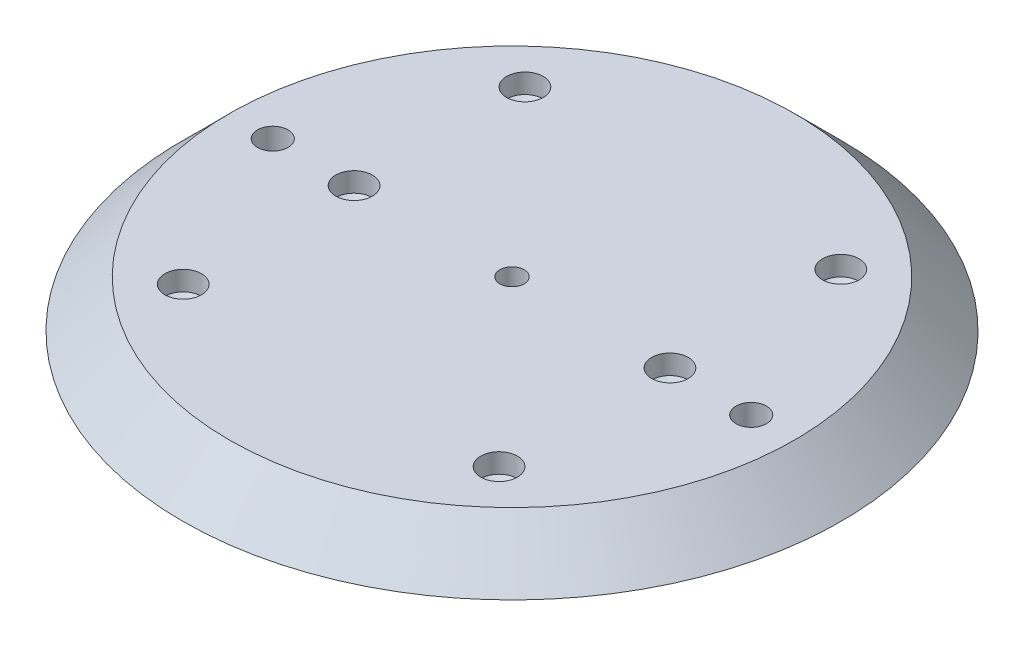
ISO-10303-21;
HEADER;
FILE_DESCRIPTION(('STEP AP214'),'2;1');
FILE_NAME('part.step','',(''),(''),'','','');
FILE_SCHEMA(('AUTOMOTIVE_DESIGN { 1 0 10303 214 1 1 1 1 }'));
ENDSEC;
DATA;
#1=APPLICATION_CONTEXT('core data for automotive mechanical design processes');
#2=APPLICATION_PROTOCOL_DEFINITION('international standard','automotive_design',2000,#1);
#3=PRODUCT_CONTEXT('',#1,'mechanical');
#4=PRODUCT('Part','Part','',(#3));
#5=PRODUCT_RELATED_PRODUCT_CATEGORY('part','',(#4));
#6=PRODUCT_DEFINITION_FORMATION('','',#4);
#7=PRODUCT_DEFINITION_CONTEXT('part definition',#1,'design');
#8=PRODUCT_DEFINITION('design','',#6,#7);
#9=PRODUCT_DEFINITION_SHAPE('','',#8);
#10=(LENGTH_UNIT() NAMED_UNIT(*) SI_UNIT(.MILLI.,.METRE.));
#11=(NAMED_UNIT(*) PLANE_ANGLE_UNIT() SI_UNIT($,.RADIAN.));
#12=(NAMED_UNIT(*) SI_UNIT($,.STERADIAN.) SOLID_ANGLE_UNIT());
#13=UNCERTAINTY_MEASURE_WITH_UNIT(LENGTH_MEASURE(1.E-05),#10,'distance_accuracy_value','');
#14=(GEOMETRIC_REPRESENTATION_CONTEXT(3) GLOBAL_UNCERTAINTY_ASSIGNED_CONTEXT((#13)) GLOBAL_UNIT_ASSIGNED_CONTEXT((#10,
#11,#12)) REPRESENTATION_CONTEXT('',''));
#15=CARTESIAN_POINT('',(0.,0.,0.));
#16=DIRECTION('',(0.,0.,1.));
#17=DIRECTION('',(1.,0.,0.));
#18=AXIS2_PLACEMENT_3D('',#15,#16,#17);
#19=CARTESIAN_POINT('',(0.,0.,0.));
#20=DIRECTION('',(0.,-1.,0.));
#21=DIRECTION('',(0.,0.,1.));
#22=AXIS2_PLACEMENT_3D('',#19,#20,#21);
#23=CONICAL_SURFACE('',#22,85.725,0.78539816339745);
#24=CARTESIAN_POINT('',(0.,12.192,0.));
#25=DIRECTION('',(0.,1.,0.));
#26=DIRECTION('',(0.,0.,1.));
#27=AXIS2_PLACEMENT_3D('',#24,#25,#26);
#28=CIRCLE('',#27,73.533);
#29=CARTESIAN_POINT('',(0.,12.192,73.533));
#30=VERTEX_POINT('',#29);
#31=EDGE_CURVE('E11',#30,#30,#28,.T.);
#32=ORIENTED_EDGE('',*,*,#31,.F.);
#33=EDGE_LOOP('',(#32));
#34=FACE_BOUND('',#33,.T.);
#35=CARTESIAN_POINT('',(0.,0.,0.));
#36=DIRECTION('',(0.,1.,0.));
#37=DIRECTION('',(0.,0.,1.));
#38=AXIS2_PLACEMENT_3D('',#35,#36,#37);
#39=CIRCLE('',#38,85.725);
#40=CARTESIAN_POINT('',(0.,0.,85.725));
#41=VERTEX_POINT('',#40);
#42=EDGE_CURVE('E42',#41,#41,#39,.T.);
#43=ORIENTED_EDGE('',*,*,#42,.T.);
#44=EDGE_LOOP('',(#43));
#45=FACE_BOUND('',#44,.T.);
#46=ADVANCED_FACE('F35',(#34,#45),#23,.T.);
#47=CARTESIAN_POINT('',(0.,12.192,0.));
#48=DIRECTION('',(0.,1.,0.));
#49=DIRECTION('',(0.,0.,1.));
#50=AXIS2_PLACEMENT_3D('',#47,#48,#49);
#51=PLANE('',#50);
#52=CARTESIAN_POINT('',(-41.0845,12.192,-44.45));
#53=DIRECTION('',(0.,1.,0.));
#54=DIRECTION('',(0.,0.,1.));
#55=AXIS2_PLACEMENT_3D('',#52,#53,#54);
#56=CIRCLE('',#55,4.7625);
#57=CARTESIAN_POINT('',(-41.0845,12.192,-39.6875));
#58=VERTEX_POINT('',#57);
#59=EDGE_CURVE('E72',#58,#58,#56,.T.);
#60=ORIENTED_EDGE('',*,*,#59,.F.);
#61=EDGE_LOOP('',(#60));
#62=FACE_BOUND('',#61,.T.);
#63=CARTESIAN_POINT('',(-41.0845,12.192,0.));
#64=DIRECTION('',(0.,1.,0.));
#65=DIRECTION('',(0.,0.,1.));
#66=AXIS2_PLACEMENT_3D('',#63,#64,#65);
#67=CIRCLE('',#66,4.7625);
#68=CARTESIAN_POINT('',(-41.0845,12.192,4.76249999999999));
#69=VERTEX_POINT('',#68);
#70=EDGE_CURVE('E71',#69,#69,#67,.T.);
#71=ORIENTED_EDGE('',*,*,#70,.F.);
#72=EDGE_LOOP('',(#71));
#73=FACE_BOUND('',#72,.T.);
#74=CARTESIAN_POINT('',(-41.0845,12.192,44.45));
#75=DIRECTION('',(0.,1.,0.));
#76=DIRECTION('',(0.,0.,1.));
#77=AXIS2_PLACEMENT_3D('',#74,#75,#76);
#78=CIRCLE('',#77,4.7625);
#79=CARTESIAN_POINT('',(-41.0845,12.192,49.2125));
#80=VERTEX_POINT('',#79);
#81=EDGE_CURVE('E82',#80,#80,#78,.T.);
#82=ORIENTED_EDGE('',*,*,#81,.F.);
#83=EDGE_LOOP('',(#82));
#84=FACE_BOUND('',#83,.T.);
#85=CARTESIAN_POINT('',(41.0845,12.192,44.45));
#86=DIRECTION('',(0.,1.,0.));
#87=DIRECTION('',(0.,0.,1.));
#88=AXIS2_PLACEMENT_3D('',#85,#86,#87);
#89=CIRCLE('',#88,4.7625);
#90=CARTESIAN_POINT('',(41.0845,12.192,49.2125));
#91=VERTEX_POINT('',#90);
#92=EDGE_CURVE('E88',#91,#91,#89,.T.);
#93=ORIENTED_EDGE('',*,*,#92,.F.);
#94=EDGE_LOOP('',(#93));
#95=FACE_BOUND('',#94,.T.);
#96=CARTESIAN_POINT('',(41.0845,12.192,0.));
#97=DIRECTION('',(0.,1.,0.));
#98=DIRECTION('',(0.,0.,1.));
#99=AXIS2_PLACEMENT_3D('',#96,#97,#98);
#100=CIRCLE('',#99,4.7625);
#101=CARTESIAN_POINT('',(41.0845,12.192,4.76249999999999));
#102=VERTEX_POINT('',#101);
#103=EDGE_CURVE('E94',#102,#102,#100,.T.);
#104=ORIENTED_EDGE('',*,*,#103,.F.);
#105=EDGE_LOOP('',(#104));
#106=FACE_BOUND('',#105,.T.);
#107=CARTESIAN_POINT('',(41.0845,12.192,-44.45));
#108=DIRECTION('',(0.,1.,0.));
#109=DIRECTION('',(0.,0.,1.));
#110=AXIS2_PLACEMENT_3D('',#107,#108,#109);
#111=CIRCLE('',#110,4.7625);
#112=CARTESIAN_POINT('',(41.0845,12.192,-39.6875));
#113=VERTEX_POINT('',#112);
#114=EDGE_CURVE('E100',#113,#113,#111,.T.);
#115=ORIENTED_EDGE('',*,*,#114,.F.);
#116=EDGE_LOOP('',(#115));
#117=FACE_BOUND('',#116,.T.);
#118=CARTESIAN_POINT('',(0.,12.192,0.));
#119=DIRECTION('',(0.,1.,0.));
#120=DIRECTION('',(0.,0.,1.));
#121=AXIS2_PLACEMENT_3D('',#118,#119,#120);
#122=CIRCLE('',#121,3.17499999999999);
#123=CARTESIAN_POINT('',(0.,12.192,3.17499999999999));
#124=VERTEX_POINT('',#123);
#125=EDGE_CURVE('E106',#124,#124,#122,.T.);
#126=ORIENTED_EDGE('',*,*,#125,.F.);
#127=EDGE_LOOP('',(#126));
#128=FACE_BOUND('',#127,.T.);
#129=CARTESIAN_POINT('',(-62.23,12.192,0.));
#130=DIRECTION('',(0.,1.,0.));
#131=DIRECTION('',(0.,0.,1.));
#132=AXIS2_PLACEMENT_3D('',#129,#130,#131);
#133=CIRCLE('',#132,3.96875);
#134=CARTESIAN_POINT('',(-62.23,12.192,3.96875));
#135=VERTEX_POINT('',#134);
#136=EDGE_CURVE('E112',#135,#135,#133,.T.);
#137=ORIENTED_EDGE('',*,*,#136,.F.);
#138=EDGE_LOOP('',(#137));
#139=FACE_BOUND('',#138,.T.);
#140=CARTESIAN_POINT('',(62.23,12.192,0.));
#141=DIRECTION('',(0.,1.,0.));
#142=DIRECTION('',(0.,0.,1.));
#143=AXIS2_PLACEMENT_3D('',#140,#141,#142);
#144=CIRCLE('',#143,3.96874999999999);
#145=CARTESIAN_POINT('',(62.23,12.192,3.96874999999999));
#146=VERTEX_POINT('',#145);
#147=EDGE_CURVE('E118',#146,#146,#144,.T.);
#148=ORIENTED_EDGE('',*,*,#147,.F.);
#149=EDGE_LOOP('',(#148));
#150=FACE_BOUND('',#149,.T.);
#151=ORIENTED_EDGE('',*,*,#31,.T.);
#152=EDGE_LOOP('',(#151));
#153=FACE_BOUND('',#152,.T.);
#154=ADVANCED_FACE('F130',(#62,#73,#84,#95,#106,#117,#128,#139,#150,#153),#51,.T.);
#155=CARTESIAN_POINT('',(0.,0.,0.));
#156=DIRECTION('',(0.,1.,0.));
#157=DIRECTION('',(0.,0.,1.));
#158=AXIS2_PLACEMENT_3D('',#155,#156,#157);
#159=PLANE('',#158);
#160=CARTESIAN_POINT('',(0.,0.,0.));
#161=DIRECTION('',(0.,1.,0.));
#162=DIRECTION('',(0.,0.,1.));
#163=AXIS2_PLACEMENT_3D('',#160,#161,#162);
#164=CIRCLE('',#163,3.175);
#165=CARTESIAN_POINT('',(0.,0.,3.175));
#166=VERTEX_POINT('',#165);
#167=EDGE_CURVE('E109',#166,#166,#164,.T.);
#168=ORIENTED_EDGE('',*,*,#167,.T.);
#169=EDGE_LOOP('',(#168));
#170=FACE_BOUND('',#169,.T.);
#171=CARTESIAN_POINT('',(-62.23,0.,0.));
#172=DIRECTION('',(0.,1.,0.));
#173=DIRECTION('',(0.,0.,1.));
#174=AXIS2_PLACEMENT_3D('',#171,#172,#173);
#175=CIRCLE('',#174,3.96874999999999);
#176=CARTESIAN_POINT('',(-62.23,0.,3.96874999999999));
#177=VERTEX_POINT('',#176);
#178=EDGE_CURVE('E115',#177,#177,#175,.T.);
#179=ORIENTED_EDGE('',*,*,#178,.T.);
#180=EDGE_LOOP('',(#179));
#181=FACE_BOUND('',#180,.T.);
#182=CARTESIAN_POINT('',(62.23,0.,0.));
#183=DIRECTION('',(0.,1.,0.));
#184=DIRECTION('',(0.,0.,1.));
#185=AXIS2_PLACEMENT_3D('',#182,#183,#184);
#186=CIRCLE('',#185,3.96874999999999);
#187=CARTESIAN_POINT('',(62.23,0.,3.96874999999999));
#188=VERTEX_POINT('',#187);
#189=EDGE_CURVE('E121',#188,#188,#186,.T.);
#190=ORIENTED_EDGE('',*,*,#189,.T.);
#191=EDGE_LOOP('',(#190));
#192=FACE_BOUND('',#191,.T.);
#193=ORIENTED_EDGE('',*,*,#42,.F.);
#194=EDGE_LOOP('',(#193));
#195=FACE_BOUND('',#194,.T.);
#196=ADVANCED_FACE('F127',(#170,#181,#192,#195),#159,.F.);
#197=CARTESIAN_POINT('',(62.23,12.192,0.));
#198=DIRECTION('',(0.,1.,0.));
#199=DIRECTION('',(0.,0.,1.));
#200=AXIS2_PLACEMENT_3D('',#197,#198,#199);
#201=CYLINDRICAL_SURFACE('',#200,3.96874999999999);
#202=ORIENTED_EDGE('',*,*,#189,.F.);
#203=EDGE_LOOP('',(#202));
#204=FACE_BOUND('',#203,.T.);
#205=ORIENTED_EDGE('',*,*,#147,.T.);
#206=EDGE_LOOP('',(#205));
#207=FACE_BOUND('',#206,.T.);
#208=ADVANCED_FACE('F129',(#204,#207),#201,.F.);
#209=CARTESIAN_POINT('',(-62.23,12.192,0.));
#210=DIRECTION('',(0.,1.,0.));
#211=DIRECTION('',(0.,0.,1.));
#212=AXIS2_PLACEMENT_3D('',#209,#210,#211);
#213=CYLINDRICAL_SURFACE('',#212,3.96875);
#214=ORIENTED_EDGE('',*,*,#178,.F.);
#215=EDGE_LOOP('',(#214));
#216=FACE_BOUND('',#215,.T.);
#217=ORIENTED_EDGE('',*,*,#136,.T.);
#218=EDGE_LOOP('',(#217));
#219=FACE_BOUND('',#218,.T.);
#220=ADVANCED_FACE('F136',(#216,#219),#213,.F.);
#221=CARTESIAN_POINT('',(0.,12.192,0.));
#222=DIRECTION('',(0.,1.,0.));
#223=DIRECTION('',(0.,0.,1.));
#224=AXIS2_PLACEMENT_3D('',#221,#222,#223);
#225=CYLINDRICAL_SURFACE('',#224,3.17499999999999);
#226=ORIENTED_EDGE('',*,*,#167,.F.);
#227=EDGE_LOOP('',(#226));
#228=FACE_BOUND('',#227,.T.);
#229=ORIENTED_EDGE('',*,*,#125,.T.);
#230=EDGE_LOOP('',(#229));
#231=FACE_BOUND('',#230,.T.);
#232=ADVANCED_FACE('F160',(#228,#231),#225,.F.);
#233=CARTESIAN_POINT('',(41.0845,7.112,-44.45));
#234=DIRECTION('',(0.,1.,0.));
#235=DIRECTION('',(0.,0.,1.));
#236=AXIS2_PLACEMENT_3D('',#233,#234,#235);
#237=CONICAL_SURFACE('',#236,4.7625,1.02974425867665);
#238=CARTESIAN_POINT('',(41.0845,4.25040130188124,-44.45));
#239=VERTEX_POINT('',#238);
#240=VERTEX_LOOP('',#239);
#241=FACE_BOUND('',#240,.T.);
#242=CARTESIAN_POINT('',(41.0845,7.112,-44.45));
#243=DIRECTION('',(0.,1.,0.));
#244=DIRECTION('',(0.,0.,1.));
#245=AXIS2_PLACEMENT_3D('',#242,#243,#244);
#246=CIRCLE('',#245,4.7625);
#247=CARTESIAN_POINT('',(41.0845,7.112,-39.6875));
#248=VERTEX_POINT('',#247);
#249=EDGE_CURVE('E103',#248,#248,#246,.T.);
#250=ORIENTED_EDGE('',*,*,#249,.T.);
#251=EDGE_LOOP('',(#250));
#252=FACE_BOUND('',#251,.T.);
#253=ADVANCED_FACE('F164',(#241,#252),#237,.F.);
#254=CARTESIAN_POINT('',(41.0845,12.192,-44.45));
#255=DIRECTION('',(0.,1.,0.));
#256=DIRECTION('',(0.,0.,1.));
#257=AXIS2_PLACEMENT_3D('',#254,#255,#256);
#258=CYLINDRICAL_SURFACE('',#257,4.7625);
#259=ORIENTED_EDGE('',*,*,#249,.F.);
#260=EDGE_LOOP('',(#259));
#261=FACE_BOUND('',#260,.T.);
#262=ORIENTED_EDGE('',*,*,#114,.T.);
#263=EDGE_LOOP('',(#262));
#264=FACE_BOUND('',#263,.T.);
#265=ADVANCED_FACE('F169',(#261,#264),#258,.F.);
#266=CARTESIAN_POINT('',(41.0845,7.112,0.));
#267=DIRECTION('',(0.,1.,0.));
#268=DIRECTION('',(0.,0.,1.));
#269=AXIS2_PLACEMENT_3D('',#266,#267,#268);
#270=CONICAL_SURFACE('',#269,4.7625,1.02974425867665);
#271=CARTESIAN_POINT('',(41.0845,4.25040130188124,0.));
#272=VERTEX_POINT('',#271);
#273=VERTEX_LOOP('',#272);
#274=FACE_BOUND('',#273,.T.);
#275=CARTESIAN_POINT('',(41.0845,7.112,0.));
#276=DIRECTION('',(0.,1.,0.));
#277=DIRECTION('',(0.,0.,1.));
#278=AXIS2_PLACEMENT_3D('',#275,#276,#277);
#279=CIRCLE('',#278,4.7625);
#280=CARTESIAN_POINT('',(41.0845,7.112,4.76249999999999));
#281=VERTEX_POINT('',#280);
#282=EDGE_CURVE('E97',#281,#281,#279,.T.);
#283=ORIENTED_EDGE('',*,*,#282,.T.);
#284=EDGE_LOOP('',(#283));
#285=FACE_BOUND('',#284,.T.);
#286=ADVANCED_FACE('F178',(#274,#285),#270,.F.);
#287=CARTESIAN_POINT('',(41.0845,12.192,0.));
#288=DIRECTION('',(0.,1.,0.));
#289=DIRECTION('',(0.,0.,1.));
#290=AXIS2_PLACEMENT_3D('',#287,#288,#289);
#291=CYLINDRICAL_SURFACE('',#290,4.7625);
#292=ORIENTED_EDGE('',*,*,#282,.F.);
#293=EDGE_LOOP('',(#292));
#294=FACE_BOUND('',#293,.T.);
#295=ORIENTED_EDGE('',*,*,#103,.T.);
#296=EDGE_LOOP('',(#295));
#297=FACE_BOUND('',#296,.T.);
#298=ADVANCED_FACE('F188',(#294,#297),#291,.F.);
#299=CARTESIAN_POINT('',(41.0845,7.112,44.45));
#300=DIRECTION('',(0.,1.,0.));
#301=DIRECTION('',(0.,0.,1.));
#302=AXIS2_PLACEMENT_3D('',#299,#300,#301);
#303=CONICAL_SURFACE('',#302,4.7625,1.02974425867665);
#304=CARTESIAN_POINT('',(41.0845,4.25040130188124,44.45));
#305=VERTEX_POINT('',#304);
#306=VERTEX_LOOP('',#305);
#307=FACE_BOUND('',#306,.T.);
#308=CARTESIAN_POINT('',(41.0845,7.112,44.45));
#309=DIRECTION('',(0.,1.,0.));
#310=DIRECTION('',(0.,0.,1.));
#311=AXIS2_PLACEMENT_3D('',#308,#309,#310);
#312=CIRCLE('',#311,4.7625);
#313=CARTESIAN_POINT('',(41.0845,7.112,49.2125));
#314=VERTEX_POINT('',#313);
#315=EDGE_CURVE('E91',#314,#314,#312,.T.);
#316=ORIENTED_EDGE('',*,*,#315,.T.);
#317=EDGE_LOOP('',(#316));
#318=FACE_BOUND('',#317,.T.);
#319=ADVANCED_FACE('F197',(#307,#318),#303,.F.);
#320=CARTESIAN_POINT('',(41.0845,12.192,44.45));
#321=DIRECTION('',(0.,1.,0.));
#322=DIRECTION('',(0.,0.,1.));
#323=AXIS2_PLACEMENT_3D('',#320,#321,#322);
#324=CYLINDRICAL_SURFACE('',#323,4.7625);
#325=ORIENTED_EDGE('',*,*,#315,.F.);
#326=EDGE_LOOP('',(#325));
#327=FACE_BOUND('',#326,.T.);
#328=ORIENTED_EDGE('',*,*,#92,.T.);
#329=EDGE_LOOP('',(#328));
#330=FACE_BOUND('',#329,.T.);
#331=ADVANCED_FACE('F207',(#327,#330),#324,.F.);
#332=CARTESIAN_POINT('',(-41.0845,7.112,44.45));
#333=DIRECTION('',(0.,1.,0.));
#334=DIRECTION('',(0.,0.,1.));
#335=AXIS2_PLACEMENT_3D('',#332,#333,#334);
#336=CONICAL_SURFACE('',#335,4.7625,1.02974425867665);
#337=CARTESIAN_POINT('',(-41.0845,4.25040130188124,44.45));
#338=VERTEX_POINT('',#337);
#339=VERTEX_LOOP('',#338);
#340=FACE_BOUND('',#339,.T.);
#341=CARTESIAN_POINT('',(-41.0845,7.112,44.45));
#342=DIRECTION('',(0.,1.,0.));
#343=DIRECTION('',(0.,0.,1.));
#344=AXIS2_PLACEMENT_3D('',#341,#342,#343);
#345=CIRCLE('',#344,4.7625);
#346=CARTESIAN_POINT('',(-41.0845,7.112,49.2125));
#347=VERTEX_POINT('',#346);
#348=EDGE_CURVE('E85',#347,#347,#345,.T.);
#349=ORIENTED_EDGE('',*,*,#348,.T.);
#350=EDGE_LOOP('',(#349));
#351=FACE_BOUND('',#350,.T.);
#352=ADVANCED_FACE('F217',(#340,#351),#336,.F.);
#353=CARTESIAN_POINT('',(-41.0845,12.192,44.45));
#354=DIRECTION('',(0.,1.,0.));
#355=DIRECTION('',(0.,0.,1.));
#356=AXIS2_PLACEMENT_3D('',#353,#354,#355);
#357=CYLINDRICAL_SURFACE('',#356,4.7625);
#358=ORIENTED_EDGE('',*,*,#348,.F.);
#359=EDGE_LOOP('',(#358));
#360=FACE_BOUND('',#359,.T.);
#361=ORIENTED_EDGE('',*,*,#81,.T.);
#362=EDGE_LOOP('',(#361));
#363=FACE_BOUND('',#362,.T.);
#364=ADVANCED_FACE('F227',(#360,#363),#357,.F.);
#365=CARTESIAN_POINT('',(-41.0845,7.112,0.));
#366=DIRECTION('',(0.,1.,0.));
#367=DIRECTION('',(0.,0.,1.));
#368=AXIS2_PLACEMENT_3D('',#365,#366,#367);
#369=CONICAL_SURFACE('',#368,4.7625,1.02974425867665);
#370=CARTESIAN_POINT('',(-41.0845,4.25040130188124,0.));
#371=VERTEX_POINT('',#370);
#372=VERTEX_LOOP('',#371);
#373=FACE_BOUND('',#372,.T.);
#374=CARTESIAN_POINT('',(-41.0845,7.112,0.));
#375=DIRECTION('',(0.,1.,0.));
#376=DIRECTION('',(0.,0.,1.));
#377=AXIS2_PLACEMENT_3D('',#374,#375,#376);
#378=CIRCLE('',#377,4.7625);
#379=CARTESIAN_POINT('',(-41.0845,7.112,4.76249999999999));
#380=VERTEX_POINT('',#379);
#381=EDGE_CURVE('E75',#380,#380,#378,.T.);
#382=ORIENTED_EDGE('',*,*,#381,.T.);
#383=EDGE_LOOP('',(#382));
#384=FACE_BOUND('',#383,.T.);
#385=ADVANCED_FACE('F237',(#373,#384),#369,.F.);
#386=CARTESIAN_POINT('',(-41.0845,12.192,0.));
#387=DIRECTION('',(0.,1.,0.));
#388=DIRECTION('',(0.,0.,1.));
#389=AXIS2_PLACEMENT_3D('',#386,#387,#388);
#390=CYLINDRICAL_SURFACE('',#389,4.7625);
#391=ORIENTED_EDGE('',*,*,#381,.F.);
#392=EDGE_LOOP('',(#391));
#393=FACE_BOUND('',#392,.T.);
#394=ORIENTED_EDGE('',*,*,#70,.T.);
#395=EDGE_LOOP('',(#394));
#396=FACE_BOUND('',#395,.T.);
#397=ADVANCED_FACE('F65',(#393,#396),#390,.F.);
#398=CARTESIAN_POINT('',(-41.0845,7.112,-44.45));
#399=DIRECTION('',(0.,1.,0.));
#400=DIRECTION('',(0.,0.,1.));
#401=AXIS2_PLACEMENT_3D('',#398,#399,#400);
#402=CONICAL_SURFACE('',#401,4.7625,1.02974425867665);
#403=CARTESIAN_POINT('',(-41.0845,4.25040130188124,-44.45));
#404=VERTEX_POINT('',#403);
#405=VERTEX_LOOP('',#404);
#406=FACE_BOUND('',#405,.T.);
#407=CARTESIAN_POINT('',(-41.0845,7.112,-44.45));
#408=DIRECTION('',(0.,1.,0.));
#409=DIRECTION('',(0.,0.,1.));
#410=AXIS2_PLACEMENT_3D('',#407,#408,#409);
#411=CIRCLE('',#410,4.7625);
#412=CARTESIAN_POINT('',(-41.0845,7.112,-39.6875));
#413=VERTEX_POINT('',#412);
#414=EDGE_CURVE('E69',#413,#413,#411,.T.);
#415=ORIENTED_EDGE('',*,*,#414,.T.);
#416=EDGE_LOOP('',(#415));
#417=FACE_BOUND('',#416,.T.);
#418=ADVANCED_FACE('F61',(#406,#417),#402,.F.);
#419=CARTESIAN_POINT('',(-41.0845,12.192,-44.45));
#420=DIRECTION('',(0.,1.,0.));
#421=DIRECTION('',(0.,0.,1.));
#422=AXIS2_PLACEMENT_3D('',#419,#420,#421);
#423=CYLINDRICAL_SURFACE('',#422,4.7625);
#424=ORIENTED_EDGE('',*,*,#414,.F.);
#425=EDGE_LOOP('',(#424));
#426=FACE_BOUND('',#425,.T.);
#427=ORIENTED_EDGE('',*,*,#59,.T.);
#428=EDGE_LOOP('',(#427));
#429=FACE_BOUND('',#428,.T.);
#430=ADVANCED_FACE('F64',(#426,#429),#423,.F.);
#431=CLOSED_SHELL('',(#46,#154,#196,#208,#220,#232,#253,#265,#286,#298,#319,#331,#352,#364,#385,
#397,#418,#430));
#432=MANIFOLD_SOLID_BREP('B2',#431);
#433=ADVANCED_BREP_SHAPE_REPRESENTATION('',(#18,#432),#14);
#434=SHAPE_DEFINITION_REPRESENTATION(#9,#433);
ENDSEC;
END-ISO-10303-21;
